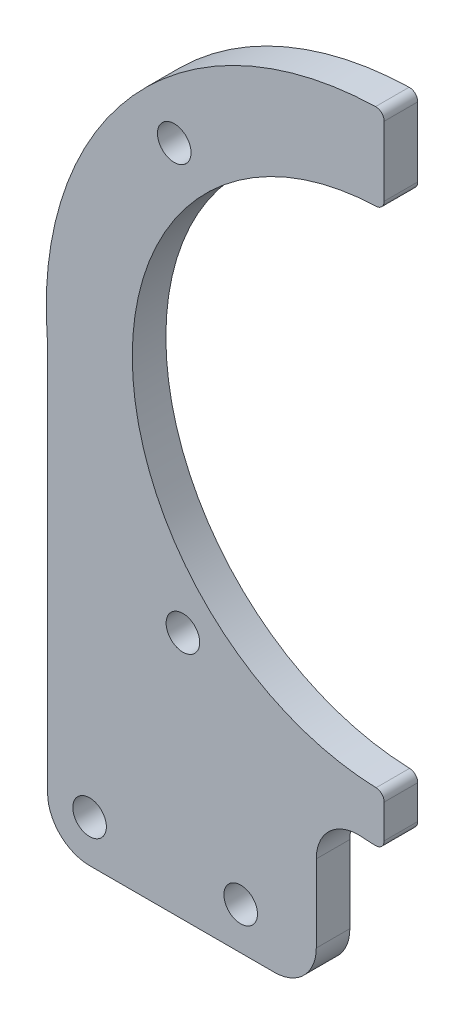
ISO-10303-21;
HEADER;
FILE_DESCRIPTION(('STEP AP214'),'2;1');
FILE_NAME('part.step','',(''),(''),'','','');
FILE_SCHEMA(('AUTOMOTIVE_DESIGN { 1 0 10303 214 1 1 1 1 }'));
ENDSEC;
DATA;
#1=APPLICATION_CONTEXT('core data for automotive mechanical design processes');
#2=APPLICATION_PROTOCOL_DEFINITION('international standard','automotive_design',2000,#1);
#3=PRODUCT_CONTEXT('',#1,'mechanical');
#4=PRODUCT('Part','Part','',(#3));
#5=PRODUCT_RELATED_PRODUCT_CATEGORY('part','',(#4));
#6=PRODUCT_DEFINITION_FORMATION('','',#4);
#7=PRODUCT_DEFINITION_CONTEXT('part definition',#1,'design');
#8=PRODUCT_DEFINITION('design','',#6,#7);
#9=PRODUCT_DEFINITION_SHAPE('','',#8);
#10=(LENGTH_UNIT() NAMED_UNIT(*) SI_UNIT(.MILLI.,.METRE.));
#11=(NAMED_UNIT(*) PLANE_ANGLE_UNIT() SI_UNIT($,.RADIAN.));
#12=(NAMED_UNIT(*) SI_UNIT($,.STERADIAN.) SOLID_ANGLE_UNIT());
#13=UNCERTAINTY_MEASURE_WITH_UNIT(LENGTH_MEASURE(1.E-05),#10,'distance_accuracy_value','');
#14=(GEOMETRIC_REPRESENTATION_CONTEXT(3) GLOBAL_UNCERTAINTY_ASSIGNED_CONTEXT((#13)) GLOBAL_UNIT_ASSIGNED_CONTEXT((#10,
#11,#12)) REPRESENTATION_CONTEXT('',''));
#15=CARTESIAN_POINT('',(0.,0.,0.));
#16=DIRECTION('',(0.,0.,1.));
#17=DIRECTION('',(1.,0.,0.));
#18=AXIS2_PLACEMENT_3D('',#15,#16,#17);
#19=CARTESIAN_POINT('',(35.0862822428805,50.0800803803024,4.));
#20=DIRECTION('',(0.,0.,1.));
#21=DIRECTION('',(1.,0.,0.));
#22=AXIS2_PLACEMENT_3D('',#19,#20,#21);
#23=PLANE('',#22);
#24=CARTESIAN_POINT('',(11.1177665862284,24.5749778081342,4.));
#25=DIRECTION('',(0.,0.,1.));
#26=DIRECTION('',(1.,0.,0.));
#27=AXIS2_PLACEMENT_3D('',#24,#25,#26);
#28=CIRCLE('',#27,2.);
#29=CARTESIAN_POINT('',(13.1177665862284,24.5749778081342,4.));
#30=VERTEX_POINT('',#29);
#31=EDGE_CURVE('E278',#30,#30,#28,.T.);
#32=ORIENTED_EDGE('',*,*,#31,.F.);
#33=EDGE_LOOP('',(#32));
#34=FACE_BOUND('',#33,.T.);
#35=CARTESIAN_POINT('',(10.0862822428805,74.5749778081342,4.));
#36=DIRECTION('',(0.,0.,1.));
#37=DIRECTION('',(1.,0.,0.));
#38=AXIS2_PLACEMENT_3D('',#35,#36,#37);
#39=CIRCLE('',#38,2.);
#40=CARTESIAN_POINT('',(12.0862822428805,74.5749778081342,4.));
#41=VERTEX_POINT('',#40);
#42=EDGE_CURVE('E267',#41,#41,#39,.T.);
#43=ORIENTED_EDGE('',*,*,#42,.F.);
#44=EDGE_LOOP('',(#43));
#45=FACE_BOUND('',#44,.T.);
#46=CARTESIAN_POINT('',(0.,0.,4.));
#47=DIRECTION('',(0.,0.,1.));
#48=DIRECTION('',(1.,0.,0.));
#49=AXIS2_PLACEMENT_3D('',#46,#47,#48);
#50=CIRCLE('',#49,2.);
#51=CARTESIAN_POINT('',(2.,0.,4.));
#52=VERTEX_POINT('',#51);
#53=EDGE_CURVE('E180',#52,#52,#50,.T.);
#54=ORIENTED_EDGE('',*,*,#53,.F.);
#55=EDGE_LOOP('',(#54));
#56=FACE_BOUND('',#55,.T.);
#57=DIRECTION('',(1.,0.,0.));
#58=VECTOR('',#57,1.);
#59=CARTESIAN_POINT('',(-5.,-5.,4.));
#60=LINE('',#59,#58);
#61=CARTESIAN_POINT('',(0.,-5.,4.));
#62=VERTEX_POINT('',#61);
#63=CARTESIAN_POINT('',(22.,-5.,4.));
#64=VERTEX_POINT('',#63);
#65=EDGE_CURVE('E289',#62,#64,#60,.T.);
#66=ORIENTED_EDGE('',*,*,#65,.T.);
#67=CARTESIAN_POINT('',(22.,0.,4.));
#68=DIRECTION('',(0.,0.,1.));
#69=DIRECTION('',(1.,0.,0.));
#70=AXIS2_PLACEMENT_3D('',#67,#68,#69);
#71=CIRCLE('',#70,5.);
#72=CARTESIAN_POINT('',(27.,0.,4.));
#73=VERTEX_POINT('',#72);
#74=EDGE_CURVE('E258',#64,#73,#71,.T.);
#75=ORIENTED_EDGE('',*,*,#74,.T.);
#76=DIRECTION('',(0.,1.,0.));
#77=VECTOR('',#76,1.);
#78=CARTESIAN_POINT('',(27.,-5.,4.));
#79=LINE('',#78,#77);
#80=CARTESIAN_POINT('',(27.,9.19640561986431,4.));
#81=VERTEX_POINT('',#80);
#82=EDGE_CURVE('E292',#73,#81,#79,.T.);
#83=ORIENTED_EDGE('',*,*,#82,.T.);
#84=CARTESIAN_POINT('',(32.,9.19640561986431,4.));
#85=DIRECTION('',(0.,0.,1.));
#86=DIRECTION('',(1.,0.,0.));
#87=AXIS2_PLACEMENT_3D('',#84,#85,#86);
#88=CIRCLE('',#87,5.);
#89=CARTESIAN_POINT('',(32.3763758832781,14.1822196150397,4.));
#90=VERTEX_POINT('',#89);
#91=EDGE_CURVE('E11',#81,#90,#88,.F.);
#92=ORIENTED_EDGE('',*,*,#91,.T.);
#93=CARTESIAN_POINT('',(35.0862822428805,50.0800803803024,4.));
#94=DIRECTION('',(0.,0.,1.));
#95=DIRECTION('',(1.,0.,0.));
#96=AXIS2_PLACEMENT_3D('',#93,#94,#95);
#97=CIRCLE('',#96,36.);
#98=CARTESIAN_POINT('',(34.0577108143091,14.0947772578285,4.));
#99=VERTEX_POINT('',#98);
#100=EDGE_CURVE('E294',#90,#99,#97,.T.);
#101=ORIENTED_EDGE('',*,*,#100,.T.);
#102=CARTESIAN_POINT('',(34.0862822428805,15.0943690112306,4.));
#103=DIRECTION('',(0.,0.,1.));
#104=DIRECTION('',(1.,0.,0.));
#105=AXIS2_PLACEMENT_3D('',#102,#103,#104);
#106=CIRCLE('',#105,1.);
#107=CARTESIAN_POINT('',(35.0862822428805,15.0943690112306,4.));
#108=VERTEX_POINT('',#107);
#109=EDGE_CURVE('E215',#99,#108,#106,.T.);
#110=ORIENTED_EDGE('',*,*,#109,.T.);
#111=DIRECTION('',(0.,1.,0.));
#112=VECTOR('',#111,1.);
#113=CARTESIAN_POINT('',(35.0862822428805,20.0800803803024,4.));
#114=LINE('',#113,#112);
#115=CARTESIAN_POINT('',(35.0862822428805,19.096213610643,4.));
#116=VERTEX_POINT('',#115);
#117=EDGE_CURVE('E296',#108,#116,#114,.T.);
#118=ORIENTED_EDGE('',*,*,#117,.T.);
#119=CARTESIAN_POINT('',(34.0862822428805,19.096213610643,4.));
#120=DIRECTION('',(0.,0.,1.));
#121=DIRECTION('',(1.,0.,0.));
#122=AXIS2_PLACEMENT_3D('',#119,#120,#121);
#123=CIRCLE('',#122,1.);
#124=CARTESIAN_POINT('',(34.1185403073966,20.0956931838579,4.));
#125=VERTEX_POINT('',#124);
#126=EDGE_CURVE('E213',#116,#125,#123,.T.);
#127=ORIENTED_EDGE('',*,*,#126,.T.);
#128=CARTESIAN_POINT('',(35.0862822428805,50.0800803803024,4.));
#129=DIRECTION('',(0.,0.,-1.));
#130=DIRECTION('',(1.,0.,0.));
#131=AXIS2_PLACEMENT_3D('',#128,#129,#130);
#132=CIRCLE('',#131,30.);
#133=CARTESIAN_POINT('',(34.1185403073966,80.0644675767469,4.));
#134=VERTEX_POINT('',#133);
#135=EDGE_CURVE('E298',#125,#134,#132,.T.);
#136=ORIENTED_EDGE('',*,*,#135,.T.);
#137=CARTESIAN_POINT('',(34.0862822428805,81.0639471499617,4.));
#138=DIRECTION('',(0.,0.,1.));
#139=DIRECTION('',(1.,0.,0.));
#140=AXIS2_PLACEMENT_3D('',#137,#138,#139);
#141=CIRCLE('',#140,1.);
#142=CARTESIAN_POINT('',(35.0862822428805,81.0639471499617,4.));
#143=VERTEX_POINT('',#142);
#144=EDGE_CURVE('E217',#134,#143,#141,.T.);
#145=ORIENTED_EDGE('',*,*,#144,.T.);
#146=DIRECTION('',(0.,1.,0.));
#147=VECTOR('',#146,1.);
#148=CARTESIAN_POINT('',(35.0862822428805,90.33232928245,4.));
#149=LINE('',#148,#147);
#150=CARTESIAN_POINT('',(35.0862822428805,89.3195890912451,4.));
#151=VERTEX_POINT('',#150);
#152=EDGE_CURVE('E173',#143,#151,#149,.T.);
#153=ORIENTED_EDGE('',*,*,#152,.T.);
#154=CARTESIAN_POINT('',(34.0862822428805,89.3195890912451,4.));
#155=DIRECTION('',(0.,0.,1.));
#156=DIRECTION('',(1.,0.,0.));
#157=AXIS2_PLACEMENT_3D('',#154,#155,#156);
#158=CIRCLE('',#157,1.);
#159=CARTESIAN_POINT('',(34.0608059955834,90.3192645189834,4.));
#160=VERTEX_POINT('',#159);
#161=EDGE_CURVE('E219',#151,#160,#158,.T.);
#162=ORIENTED_EDGE('',*,*,#161,.T.);
#163=CARTESIAN_POINT('',(35.0862822428805,50.0800803803024,4.));
#164=DIRECTION('',(0.,0.,1.));
#165=DIRECTION('',(1.,0.,0.));
#166=AXIS2_PLACEMENT_3D('',#163,#164,#165);
#167=CIRCLE('',#166,40.2522489021477);
#168=CARTESIAN_POINT('',(-5.03302671281246,46.8113511779821,4.));
#169=VERTEX_POINT('',#168);
#170=EDGE_CURVE('E171',#160,#169,#167,.T.);
#171=ORIENTED_EDGE('',*,*,#170,.T.);
#172=CARTESIAN_POINT('',(-15.,45.9992899164445,4.));
#173=DIRECTION('',(0.,0.,1.));
#174=DIRECTION('',(1.,0.,0.));
#175=AXIS2_PLACEMENT_3D('',#172,#173,#174);
#176=CIRCLE('',#175,10.);
#177=CARTESIAN_POINT('',(-5.,45.9992899164445,4.));
#178=VERTEX_POINT('',#177);
#179=EDGE_CURVE('E240',#169,#178,#176,.F.);
#180=ORIENTED_EDGE('',*,*,#179,.T.);
#181=DIRECTION('',(0.,-1.,0.));
#182=VECTOR('',#181,1.);
#183=CARTESIAN_POINT('',(-5.,-5.,4.));
#184=LINE('',#183,#182);
#185=CARTESIAN_POINT('',(-5.,0.,4.));
#186=VERTEX_POINT('',#185);
#187=EDGE_CURVE('E286',#178,#186,#184,.T.);
#188=ORIENTED_EDGE('',*,*,#187,.T.);
#189=CARTESIAN_POINT('',(0.,0.,4.));
#190=DIRECTION('',(0.,0.,1.));
#191=DIRECTION('',(1.,0.,0.));
#192=AXIS2_PLACEMENT_3D('',#189,#190,#191);
#193=CIRCLE('',#192,5.);
#194=EDGE_CURVE('E249',#186,#62,#193,.T.);
#195=ORIENTED_EDGE('',*,*,#194,.T.);
#196=EDGE_LOOP('',(#66,#75,#83,#92,#101,#110,#118,#127,#136,#145,#153,#162,#171,#180,#188,#195));
#197=FACE_BOUND('',#196,.T.);
#198=CARTESIAN_POINT('',(18.,0.,4.));
#199=DIRECTION('',(0.,0.,1.));
#200=DIRECTION('',(1.,0.,0.));
#201=AXIS2_PLACEMENT_3D('',#198,#199,#200);
#202=CIRCLE('',#201,2.);
#203=CARTESIAN_POINT('',(20.,0.,4.));
#204=VERTEX_POINT('',#203);
#205=EDGE_CURVE('E271',#204,#204,#202,.T.);
#206=ORIENTED_EDGE('',*,*,#205,.F.);
#207=EDGE_LOOP('',(#206));
#208=FACE_BOUND('',#207,.T.);
#209=ADVANCED_FACE('F37',(#34,#45,#56,#197,#208),#23,.T.);
#210=CARTESIAN_POINT('',(35.0862822428805,50.0800803803024,0.));
#211=DIRECTION('',(0.,0.,1.));
#212=DIRECTION('',(1.,0.,0.));
#213=AXIS2_PLACEMENT_3D('',#210,#211,#212);
#214=PLANE('',#213);
#215=CARTESIAN_POINT('',(11.1177665862284,24.5749778081342,0.));
#216=DIRECTION('',(0.,0.,1.));
#217=DIRECTION('',(1.,0.,0.));
#218=AXIS2_PLACEMENT_3D('',#215,#216,#217);
#219=CIRCLE('',#218,2.);
#220=CARTESIAN_POINT('',(13.1177665862284,24.5749778081342,0.));
#221=VERTEX_POINT('',#220);
#222=EDGE_CURVE('E41',#221,#221,#219,.T.);
#223=ORIENTED_EDGE('',*,*,#222,.T.);
#224=EDGE_LOOP('',(#223));
#225=FACE_BOUND('',#224,.T.);
#226=CARTESIAN_POINT('',(10.0862822428805,74.5749778081342,0.));
#227=DIRECTION('',(0.,0.,1.));
#228=DIRECTION('',(1.,0.,0.));
#229=AXIS2_PLACEMENT_3D('',#226,#227,#228);
#230=CIRCLE('',#229,2.);
#231=CARTESIAN_POINT('',(12.0862822428805,74.5749778081342,0.));
#232=VERTEX_POINT('',#231);
#233=EDGE_CURVE('E264',#232,#232,#230,.T.);
#234=ORIENTED_EDGE('',*,*,#233,.T.);
#235=EDGE_LOOP('',(#234));
#236=FACE_BOUND('',#235,.T.);
#237=DIRECTION('',(0.,1.,0.));
#238=VECTOR('',#237,1.);
#239=CARTESIAN_POINT('',(27.,-5.,0.));
#240=LINE('',#239,#238);
#241=CARTESIAN_POINT('',(27.,0.,0.));
#242=VERTEX_POINT('',#241);
#243=CARTESIAN_POINT('',(27.,9.19640561986431,0.));
#244=VERTEX_POINT('',#243);
#245=EDGE_CURVE('E193',#242,#244,#240,.T.);
#246=ORIENTED_EDGE('',*,*,#245,.F.);
#247=CARTESIAN_POINT('',(22.,0.,0.));
#248=DIRECTION('',(0.,0.,1.));
#249=DIRECTION('',(1.,0.,0.));
#250=AXIS2_PLACEMENT_3D('',#247,#248,#249);
#251=CIRCLE('',#250,5.);
#252=CARTESIAN_POINT('',(22.,-5.,0.));
#253=VERTEX_POINT('',#252);
#254=EDGE_CURVE('E254',#242,#253,#251,.F.);
#255=ORIENTED_EDGE('',*,*,#254,.T.);
#256=DIRECTION('',(1.,0.,0.));
#257=VECTOR('',#256,1.);
#258=CARTESIAN_POINT('',(-5.,-5.,0.));
#259=LINE('',#258,#257);
#260=CARTESIAN_POINT('',(0.,-5.,0.));
#261=VERTEX_POINT('',#260);
#262=EDGE_CURVE('E183',#261,#253,#259,.T.);
#263=ORIENTED_EDGE('',*,*,#262,.F.);
#264=CARTESIAN_POINT('',(0.,0.,0.));
#265=DIRECTION('',(0.,0.,1.));
#266=DIRECTION('',(1.,0.,0.));
#267=AXIS2_PLACEMENT_3D('',#264,#265,#266);
#268=CIRCLE('',#267,5.);
#269=CARTESIAN_POINT('',(-5.,0.,0.));
#270=VERTEX_POINT('',#269);
#271=EDGE_CURVE('E245',#261,#270,#268,.F.);
#272=ORIENTED_EDGE('',*,*,#271,.T.);
#273=DIRECTION('',(0.,-1.,0.));
#274=VECTOR('',#273,1.);
#275=CARTESIAN_POINT('',(-5.,-5.,0.));
#276=LINE('',#275,#274);
#277=CARTESIAN_POINT('',(-5.,45.9992899164445,0.));
#278=VERTEX_POINT('',#277);
#279=EDGE_CURVE('E179',#278,#270,#276,.T.);
#280=ORIENTED_EDGE('',*,*,#279,.F.);
#281=CARTESIAN_POINT('',(-15.,45.9992899164445,0.));
#282=DIRECTION('',(0.,0.,1.));
#283=DIRECTION('',(1.,0.,0.));
#284=AXIS2_PLACEMENT_3D('',#281,#282,#283);
#285=CIRCLE('',#284,10.);
#286=CARTESIAN_POINT('',(-5.03302671281246,46.8113511779821,0.));
#287=VERTEX_POINT('',#286);
#288=EDGE_CURVE('E178',#278,#287,#285,.T.);
#289=ORIENTED_EDGE('',*,*,#288,.T.);
#290=CARTESIAN_POINT('',(35.0862822428805,50.0800803803024,0.));
#291=DIRECTION('',(0.,0.,1.));
#292=DIRECTION('',(1.,0.,0.));
#293=AXIS2_PLACEMENT_3D('',#290,#291,#292);
#294=CIRCLE('',#293,40.2522489021477);
#295=CARTESIAN_POINT('',(34.0608059955834,90.3192645189834,0.));
#296=VERTEX_POINT('',#295);
#297=EDGE_CURVE('E168',#296,#287,#294,.T.);
#298=ORIENTED_EDGE('',*,*,#297,.F.);
#299=CARTESIAN_POINT('',(34.0862822428805,89.3195890912451,0.));
#300=DIRECTION('',(0.,0.,1.));
#301=DIRECTION('',(1.,0.,0.));
#302=AXIS2_PLACEMENT_3D('',#299,#300,#301);
#303=CIRCLE('',#302,1.);
#304=CARTESIAN_POINT('',(35.0862822428805,89.3195890912451,0.));
#305=VERTEX_POINT('',#304);
#306=EDGE_CURVE('E152',#296,#305,#303,.F.);
#307=ORIENTED_EDGE('',*,*,#306,.T.);
#308=DIRECTION('',(0.,1.,0.));
#309=VECTOR('',#308,1.);
#310=CARTESIAN_POINT('',(35.0862822428805,90.33232928245,0.));
#311=LINE('',#310,#309);
#312=CARTESIAN_POINT('',(35.0862822428805,81.0639471499617,0.));
#313=VERTEX_POINT('',#312);
#314=EDGE_CURVE('E203',#313,#305,#311,.T.);
#315=ORIENTED_EDGE('',*,*,#314,.F.);
#316=CARTESIAN_POINT('',(34.0862822428805,81.0639471499617,0.));
#317=DIRECTION('',(0.,0.,1.));
#318=DIRECTION('',(1.,0.,0.));
#319=AXIS2_PLACEMENT_3D('',#316,#317,#318);
#320=CIRCLE('',#319,1.);
#321=CARTESIAN_POINT('',(34.1185403073966,80.0644675767469,0.));
#322=VERTEX_POINT('',#321);
#323=EDGE_CURVE('E162',#313,#322,#320,.F.);
#324=ORIENTED_EDGE('',*,*,#323,.T.);
#325=CARTESIAN_POINT('',(35.0862822428805,50.0800803803024,0.));
#326=DIRECTION('',(0.,0.,-1.));
#327=DIRECTION('',(1.,0.,0.));
#328=AXIS2_PLACEMENT_3D('',#325,#326,#327);
#329=CIRCLE('',#328,30.);
#330=CARTESIAN_POINT('',(34.1185403073966,20.0956931838579,0.));
#331=VERTEX_POINT('',#330);
#332=EDGE_CURVE('E200',#331,#322,#329,.T.);
#333=ORIENTED_EDGE('',*,*,#332,.F.);
#334=CARTESIAN_POINT('',(34.0862822428805,19.096213610643,0.));
#335=DIRECTION('',(0.,0.,1.));
#336=DIRECTION('',(1.,0.,0.));
#337=AXIS2_PLACEMENT_3D('',#334,#335,#336);
#338=CIRCLE('',#337,1.);
#339=CARTESIAN_POINT('',(35.0862822428805,19.096213610643,0.));
#340=VERTEX_POINT('',#339);
#341=EDGE_CURVE('E172',#331,#340,#338,.F.);
#342=ORIENTED_EDGE('',*,*,#341,.T.);
#343=DIRECTION('',(0.,1.,0.));
#344=VECTOR('',#343,1.);
#345=CARTESIAN_POINT('',(35.0862822428805,20.0800803803024,0.));
#346=LINE('',#345,#344);
#347=CARTESIAN_POINT('',(35.0862822428805,15.0943690112306,0.));
#348=VERTEX_POINT('',#347);
#349=EDGE_CURVE('E197',#348,#340,#346,.T.);
#350=ORIENTED_EDGE('',*,*,#349,.F.);
#351=CARTESIAN_POINT('',(34.0862822428805,15.0943690112306,0.));
#352=DIRECTION('',(0.,0.,1.));
#353=DIRECTION('',(1.,0.,0.));
#354=AXIS2_PLACEMENT_3D('',#351,#352,#353);
#355=CIRCLE('',#354,1.);
#356=CARTESIAN_POINT('',(34.0577108143091,14.0947772578285,0.));
#357=VERTEX_POINT('',#356);
#358=EDGE_CURVE('E206',#348,#357,#355,.F.);
#359=ORIENTED_EDGE('',*,*,#358,.T.);
#360=CARTESIAN_POINT('',(35.0862822428805,50.0800803803024,0.));
#361=DIRECTION('',(0.,0.,1.));
#362=DIRECTION('',(1.,0.,0.));
#363=AXIS2_PLACEMENT_3D('',#360,#361,#362);
#364=CIRCLE('',#363,36.);
#365=CARTESIAN_POINT('',(32.3763758832781,14.1822196150397,0.));
#366=VERTEX_POINT('',#365);
#367=EDGE_CURVE('E195',#366,#357,#364,.T.);
#368=ORIENTED_EDGE('',*,*,#367,.F.);
#369=CARTESIAN_POINT('',(32.,9.19640561986431,0.));
#370=DIRECTION('',(0.,0.,1.));
#371=DIRECTION('',(1.,0.,0.));
#372=AXIS2_PLACEMENT_3D('',#369,#370,#371);
#373=CIRCLE('',#372,5.);
#374=EDGE_CURVE('E46',#366,#244,#373,.T.);
#375=ORIENTED_EDGE('',*,*,#374,.T.);
#376=EDGE_LOOP('',(#246,#255,#263,#272,#280,#289,#298,#307,#315,#324,#333,#342,#350,#359,#368,#375));
#377=FACE_BOUND('',#376,.T.);
#378=CARTESIAN_POINT('',(0.,0.,0.));
#379=DIRECTION('',(0.,0.,1.));
#380=DIRECTION('',(1.,0.,0.));
#381=AXIS2_PLACEMENT_3D('',#378,#379,#380);
#382=CIRCLE('',#381,2.);
#383=CARTESIAN_POINT('',(2.,0.,0.));
#384=VERTEX_POINT('',#383);
#385=EDGE_CURVE('E186',#384,#384,#382,.T.);
#386=ORIENTED_EDGE('',*,*,#385,.T.);
#387=EDGE_LOOP('',(#386));
#388=FACE_BOUND('',#387,.T.);
#389=CARTESIAN_POINT('',(18.,0.,0.));
#390=DIRECTION('',(0.,0.,1.));
#391=DIRECTION('',(1.,0.,0.));
#392=AXIS2_PLACEMENT_3D('',#389,#390,#391);
#393=CIRCLE('',#392,2.);
#394=CARTESIAN_POINT('',(20.,0.,0.));
#395=VERTEX_POINT('',#394);
#396=EDGE_CURVE('E266',#395,#395,#393,.T.);
#397=ORIENTED_EDGE('',*,*,#396,.T.);
#398=EDGE_LOOP('',(#397));
#399=FACE_BOUND('',#398,.T.);
#400=ADVANCED_FACE('F175',(#225,#236,#377,#388,#399),#214,.F.);
#401=CARTESIAN_POINT('',(35.0862822428805,50.0800803803024,4.));
#402=DIRECTION('',(0.,0.,-1.));
#403=DIRECTION('',(-1.,0.,0.));
#404=AXIS2_PLACEMENT_3D('',#401,#402,#403);
#405=CYLINDRICAL_SURFACE('',#404,40.2522489021477);
#406=ORIENTED_EDGE('',*,*,#297,.T.);
#407=DIRECTION('',(0.,0.,-1.));
#408=VECTOR('',#407,1.);
#409=CARTESIAN_POINT('',(-5.03302671281247,46.8113511779821,4.));
#410=LINE('',#409,#408);
#411=EDGE_CURVE('E237',#287,#169,#410,.F.);
#412=ORIENTED_EDGE('',*,*,#411,.T.);
#413=ORIENTED_EDGE('',*,*,#170,.F.);
#414=DIRECTION('',(0.,0.,-1.));
#415=VECTOR('',#414,1.);
#416=CARTESIAN_POINT('',(34.0608059955834,90.3192645189834,4.));
#417=LINE('',#416,#415);
#418=EDGE_CURVE('E156',#160,#296,#417,.T.);
#419=ORIENTED_EDGE('',*,*,#418,.T.);
#420=EDGE_LOOP('',(#406,#412,#413,#419));
#421=FACE_BOUND('',#420,.T.);
#422=ADVANCED_FACE('F167',(#421),#405,.T.);
#423=CARTESIAN_POINT('',(-5.,-5.,4.));
#424=DIRECTION('',(1.,0.,0.));
#425=DIRECTION('',(0.,1.,0.));
#426=AXIS2_PLACEMENT_3D('',#423,#424,#425);
#427=PLANE('',#426);
#428=ORIENTED_EDGE('',*,*,#279,.T.);
#429=DIRECTION('',(0.,0.,-1.));
#430=VECTOR('',#429,1.);
#431=CARTESIAN_POINT('',(-5.,0.,4.));
#432=LINE('',#431,#430);
#433=EDGE_CURVE('E247',#270,#186,#432,.F.);
#434=ORIENTED_EDGE('',*,*,#433,.T.);
#435=ORIENTED_EDGE('',*,*,#187,.F.);
#436=DIRECTION('',(0.,0.,1.));
#437=VECTOR('',#436,1.);
#438=CARTESIAN_POINT('',(-5.,45.9992899164445,0.));
#439=LINE('',#438,#437);
#440=EDGE_CURVE('E234',#178,#278,#439,.F.);
#441=ORIENTED_EDGE('',*,*,#440,.T.);
#442=EDGE_LOOP('',(#428,#434,#435,#441));
#443=FACE_BOUND('',#442,.T.);
#444=ADVANCED_FACE('F351',(#443),#427,.F.);
#445=CARTESIAN_POINT('',(-5.,-5.,4.));
#446=DIRECTION('',(0.,1.,0.));
#447=DIRECTION('',(0.,0.,1.));
#448=AXIS2_PLACEMENT_3D('',#445,#446,#447);
#449=PLANE('',#448);
#450=ORIENTED_EDGE('',*,*,#262,.T.);
#451=DIRECTION('',(0.,0.,-1.));
#452=VECTOR('',#451,1.);
#453=CARTESIAN_POINT('',(22.,-5.,4.));
#454=LINE('',#453,#452);
#455=EDGE_CURVE('E256',#253,#64,#454,.F.);
#456=ORIENTED_EDGE('',*,*,#455,.T.);
#457=ORIENTED_EDGE('',*,*,#65,.F.);
#458=DIRECTION('',(0.,0.,-1.));
#459=VECTOR('',#458,1.);
#460=CARTESIAN_POINT('',(0.,-5.,4.));
#461=LINE('',#460,#459);
#462=EDGE_CURVE('E242',#62,#261,#461,.T.);
#463=ORIENTED_EDGE('',*,*,#462,.T.);
#464=EDGE_LOOP('',(#450,#456,#457,#463));
#465=FACE_BOUND('',#464,.T.);
#466=ADVANCED_FACE('F343',(#465),#449,.F.);
#467=CARTESIAN_POINT('',(27.,-5.,4.));
#468=DIRECTION('',(-1.,0.,0.));
#469=DIRECTION('',(0.,-1.,0.));
#470=AXIS2_PLACEMENT_3D('',#467,#468,#469);
#471=PLANE('',#470);
#472=ORIENTED_EDGE('',*,*,#245,.T.);
#473=DIRECTION('',(0.,0.,1.));
#474=VECTOR('',#473,1.);
#475=CARTESIAN_POINT('',(27.,9.19640561986431,4.));
#476=LINE('',#475,#474);
#477=EDGE_CURVE('E60',#244,#81,#476,.T.);
#478=ORIENTED_EDGE('',*,*,#477,.T.);
#479=ORIENTED_EDGE('',*,*,#82,.F.);
#480=DIRECTION('',(0.,0.,-1.));
#481=VECTOR('',#480,1.);
#482=CARTESIAN_POINT('',(27.,0.,4.));
#483=LINE('',#482,#481);
#484=EDGE_CURVE('E251',#73,#242,#483,.T.);
#485=ORIENTED_EDGE('',*,*,#484,.T.);
#486=EDGE_LOOP('',(#472,#478,#479,#485));
#487=FACE_BOUND('',#486,.T.);
#488=ADVANCED_FACE('F337',(#487),#471,.F.);
#489=CARTESIAN_POINT('',(35.0862822428805,50.0800803803024,4.));
#490=DIRECTION('',(0.,0.,-1.));
#491=DIRECTION('',(-1.,0.,0.));
#492=AXIS2_PLACEMENT_3D('',#489,#490,#491);
#493=CYLINDRICAL_SURFACE('',#492,36.);
#494=ORIENTED_EDGE('',*,*,#100,.F.);
#495=DIRECTION('',(0.,0.,-1.));
#496=VECTOR('',#495,1.);
#497=CARTESIAN_POINT('',(32.3763758832781,14.1822196150397,4.));
#498=LINE('',#497,#496);
#499=EDGE_CURVE('E260',#90,#366,#498,.T.);
#500=ORIENTED_EDGE('',*,*,#499,.T.);
#501=ORIENTED_EDGE('',*,*,#367,.T.);
#502=DIRECTION('',(0.,0.,-1.));
#503=VECTOR('',#502,1.);
#504=CARTESIAN_POINT('',(34.0577108143091,14.0947772578285,4.));
#505=LINE('',#504,#503);
#506=EDGE_CURVE('E231',#357,#99,#505,.F.);
#507=ORIENTED_EDGE('',*,*,#506,.T.);
#508=EDGE_LOOP('',(#494,#500,#501,#507));
#509=FACE_BOUND('',#508,.T.);
#510=ADVANCED_FACE('F331',(#509),#493,.T.);
#511=CARTESIAN_POINT('',(35.0862822428805,20.0800803803024,4.));
#512=DIRECTION('',(-1.,0.,0.));
#513=DIRECTION('',(0.,0.,1.));
#514=AXIS2_PLACEMENT_3D('',#511,#512,#513);
#515=PLANE('',#514);
#516=ORIENTED_EDGE('',*,*,#117,.F.);
#517=DIRECTION('',(0.,0.,-1.));
#518=VECTOR('',#517,1.);
#519=CARTESIAN_POINT('',(35.0862822428805,15.0943690112306,4.));
#520=LINE('',#519,#518);
#521=EDGE_CURVE('E228',#108,#348,#520,.T.);
#522=ORIENTED_EDGE('',*,*,#521,.T.);
#523=ORIENTED_EDGE('',*,*,#349,.T.);
#524=DIRECTION('',(0.,0.,-1.));
#525=VECTOR('',#524,1.);
#526=CARTESIAN_POINT('',(35.0862822428805,19.096213610643,4.));
#527=LINE('',#526,#525);
#528=EDGE_CURVE('E226',#340,#116,#527,.F.);
#529=ORIENTED_EDGE('',*,*,#528,.T.);
#530=EDGE_LOOP('',(#516,#522,#523,#529));
#531=FACE_BOUND('',#530,.T.);
#532=ADVANCED_FACE('F323',(#531),#515,.F.);
#533=CARTESIAN_POINT('',(35.0862822428805,50.0800803803024,4.));
#534=DIRECTION('',(0.,0.,-1.));
#535=DIRECTION('',(-1.,0.,0.));
#536=AXIS2_PLACEMENT_3D('',#533,#534,#535);
#537=CYLINDRICAL_SURFACE('',#536,30.);
#538=ORIENTED_EDGE('',*,*,#332,.T.);
#539=DIRECTION('',(0.,0.,-1.));
#540=VECTOR('',#539,1.);
#541=CARTESIAN_POINT('',(34.1185403073966,80.0644675767469,4.));
#542=LINE('',#541,#540);
#543=EDGE_CURVE('E224',#322,#134,#542,.F.);
#544=ORIENTED_EDGE('',*,*,#543,.T.);
#545=ORIENTED_EDGE('',*,*,#135,.F.);
#546=DIRECTION('',(0.,0.,-1.));
#547=VECTOR('',#546,1.);
#548=CARTESIAN_POINT('',(34.1185403073966,20.0956931838579,4.));
#549=LINE('',#548,#547);
#550=EDGE_CURVE('E221',#125,#331,#549,.T.);
#551=ORIENTED_EDGE('',*,*,#550,.T.);
#552=EDGE_LOOP('',(#538,#544,#545,#551));
#553=FACE_BOUND('',#552,.T.);
#554=ADVANCED_FACE('F314',(#553),#537,.F.);
#555=CARTESIAN_POINT('',(35.0862822428805,90.33232928245,4.));
#556=DIRECTION('',(-1.,0.,0.));
#557=DIRECTION('',(0.,0.,1.));
#558=AXIS2_PLACEMENT_3D('',#555,#556,#557);
#559=PLANE('',#558);
#560=ORIENTED_EDGE('',*,*,#314,.T.);
#561=DIRECTION('',(0.,0.,-1.));
#562=VECTOR('',#561,1.);
#563=CARTESIAN_POINT('',(35.0862822428805,89.3195890912451,4.));
#564=LINE('',#563,#562);
#565=EDGE_CURVE('E157',#305,#151,#564,.F.);
#566=ORIENTED_EDGE('',*,*,#565,.T.);
#567=ORIENTED_EDGE('',*,*,#152,.F.);
#568=DIRECTION('',(0.,0.,-1.));
#569=VECTOR('',#568,1.);
#570=CARTESIAN_POINT('',(35.0862822428805,81.0639471499617,4.));
#571=LINE('',#570,#569);
#572=EDGE_CURVE('E161',#143,#313,#571,.T.);
#573=ORIENTED_EDGE('',*,*,#572,.T.);
#574=EDGE_LOOP('',(#560,#566,#567,#573));
#575=FACE_BOUND('',#574,.T.);
#576=ADVANCED_FACE('F308',(#575),#559,.F.);
#577=CARTESIAN_POINT('',(0.,0.,4.));
#578=DIRECTION('',(0.,0.,-1.));
#579=DIRECTION('',(-1.,0.,0.));
#580=AXIS2_PLACEMENT_3D('',#577,#578,#579);
#581=CYLINDRICAL_SURFACE('',#580,2.);
#582=ORIENTED_EDGE('',*,*,#53,.T.);
#583=EDGE_LOOP('',(#582));
#584=FACE_BOUND('',#583,.T.);
#585=ORIENTED_EDGE('',*,*,#385,.F.);
#586=EDGE_LOOP('',(#585));
#587=FACE_BOUND('',#586,.T.);
#588=ADVANCED_FACE('F376',(#584,#587),#581,.F.);
#589=CARTESIAN_POINT('',(18.,0.,4.));
#590=DIRECTION('',(0.,0.,-1.));
#591=DIRECTION('',(-1.,0.,0.));
#592=AXIS2_PLACEMENT_3D('',#589,#590,#591);
#593=CYLINDRICAL_SURFACE('',#592,2.);
#594=ORIENTED_EDGE('',*,*,#205,.T.);
#595=EDGE_LOOP('',(#594));
#596=FACE_BOUND('',#595,.T.);
#597=ORIENTED_EDGE('',*,*,#396,.F.);
#598=EDGE_LOOP('',(#597));
#599=FACE_BOUND('',#598,.T.);
#600=ADVANCED_FACE('F397',(#596,#599),#593,.F.);
#601=CARTESIAN_POINT('',(34.0862822428805,89.3195890912451,4.));
#602=DIRECTION('',(0.,0.,-1.));
#603=DIRECTION('',(-1.,0.,0.));
#604=AXIS2_PLACEMENT_3D('',#601,#602,#603);
#605=CYLINDRICAL_SURFACE('',#604,1.);
#606=ORIENTED_EDGE('',*,*,#161,.F.);
#607=ORIENTED_EDGE('',*,*,#565,.F.);
#608=ORIENTED_EDGE('',*,*,#306,.F.);
#609=ORIENTED_EDGE('',*,*,#418,.F.);
#610=EDGE_LOOP('',(#606,#607,#608,#609));
#611=FACE_BOUND('',#610,.T.);
#612=ADVANCED_FACE('F155',(#611),#605,.T.);
#613=CARTESIAN_POINT('',(34.0862822428805,81.0639471499617,4.));
#614=DIRECTION('',(0.,0.,-1.));
#615=DIRECTION('',(-1.,0.,0.));
#616=AXIS2_PLACEMENT_3D('',#613,#614,#615);
#617=CYLINDRICAL_SURFACE('',#616,1.);
#618=ORIENTED_EDGE('',*,*,#144,.F.);
#619=ORIENTED_EDGE('',*,*,#543,.F.);
#620=ORIENTED_EDGE('',*,*,#323,.F.);
#621=ORIENTED_EDGE('',*,*,#572,.F.);
#622=EDGE_LOOP('',(#618,#619,#620,#621));
#623=FACE_BOUND('',#622,.T.);
#624=ADVANCED_FACE('F310',(#623),#617,.T.);
#625=CARTESIAN_POINT('',(34.0862822428805,15.0943690112306,4.));
#626=DIRECTION('',(0.,0.,-1.));
#627=DIRECTION('',(-1.,0.,0.));
#628=AXIS2_PLACEMENT_3D('',#625,#626,#627);
#629=CYLINDRICAL_SURFACE('',#628,1.);
#630=ORIENTED_EDGE('',*,*,#109,.F.);
#631=ORIENTED_EDGE('',*,*,#506,.F.);
#632=ORIENTED_EDGE('',*,*,#358,.F.);
#633=ORIENTED_EDGE('',*,*,#521,.F.);
#634=EDGE_LOOP('',(#630,#631,#632,#633));
#635=FACE_BOUND('',#634,.T.);
#636=ADVANCED_FACE('F327',(#635),#629,.T.);
#637=CARTESIAN_POINT('',(34.0862822428805,19.096213610643,4.));
#638=DIRECTION('',(0.,0.,-1.));
#639=DIRECTION('',(-1.,0.,0.));
#640=AXIS2_PLACEMENT_3D('',#637,#638,#639);
#641=CYLINDRICAL_SURFACE('',#640,1.);
#642=ORIENTED_EDGE('',*,*,#126,.F.);
#643=ORIENTED_EDGE('',*,*,#528,.F.);
#644=ORIENTED_EDGE('',*,*,#341,.F.);
#645=ORIENTED_EDGE('',*,*,#550,.F.);
#646=EDGE_LOOP('',(#642,#643,#644,#645));
#647=FACE_BOUND('',#646,.T.);
#648=ADVANCED_FACE('F318',(#647),#641,.T.);
#649=CARTESIAN_POINT('',(-15.,45.9992899164445,4.));
#650=DIRECTION('',(0.,0.,-1.));
#651=DIRECTION('',(-1.,0.,0.));
#652=AXIS2_PLACEMENT_3D('',#649,#650,#651);
#653=CYLINDRICAL_SURFACE('',#652,10.);
#654=ORIENTED_EDGE('',*,*,#179,.F.);
#655=ORIENTED_EDGE('',*,*,#411,.F.);
#656=ORIENTED_EDGE('',*,*,#288,.F.);
#657=ORIENTED_EDGE('',*,*,#440,.F.);
#658=EDGE_LOOP('',(#654,#655,#656,#657));
#659=FACE_BOUND('',#658,.T.);
#660=ADVANCED_FACE('F356',(#659),#653,.F.);
#661=CARTESIAN_POINT('',(0.,0.,4.));
#662=DIRECTION('',(0.,0.,-1.));
#663=DIRECTION('',(-1.,0.,0.));
#664=AXIS2_PLACEMENT_3D('',#661,#662,#663);
#665=CYLINDRICAL_SURFACE('',#664,5.);
#666=ORIENTED_EDGE('',*,*,#194,.F.);
#667=ORIENTED_EDGE('',*,*,#433,.F.);
#668=ORIENTED_EDGE('',*,*,#271,.F.);
#669=ORIENTED_EDGE('',*,*,#462,.F.);
#670=EDGE_LOOP('',(#666,#667,#668,#669));
#671=FACE_BOUND('',#670,.T.);
#672=ADVANCED_FACE('F348',(#671),#665,.T.);
#673=CARTESIAN_POINT('',(22.,0.,4.));
#674=DIRECTION('',(0.,0.,-1.));
#675=DIRECTION('',(-1.,0.,0.));
#676=AXIS2_PLACEMENT_3D('',#673,#674,#675);
#677=CYLINDRICAL_SURFACE('',#676,5.);
#678=ORIENTED_EDGE('',*,*,#74,.F.);
#679=ORIENTED_EDGE('',*,*,#455,.F.);
#680=ORIENTED_EDGE('',*,*,#254,.F.);
#681=ORIENTED_EDGE('',*,*,#484,.F.);
#682=EDGE_LOOP('',(#678,#679,#680,#681));
#683=FACE_BOUND('',#682,.T.);
#684=ADVANCED_FACE('F339',(#683),#677,.T.);
#685=CARTESIAN_POINT('',(32.,9.19640561986431,4.));
#686=DIRECTION('',(0.,0.,-1.));
#687=DIRECTION('',(-1.,0.,0.));
#688=AXIS2_PLACEMENT_3D('',#685,#686,#687);
#689=CYLINDRICAL_SURFACE('',#688,5.);
#690=ORIENTED_EDGE('',*,*,#91,.F.);
#691=ORIENTED_EDGE('',*,*,#477,.F.);
#692=ORIENTED_EDGE('',*,*,#374,.F.);
#693=ORIENTED_EDGE('',*,*,#499,.F.);
#694=EDGE_LOOP('',(#690,#691,#692,#693));
#695=FACE_BOUND('',#694,.T.);
#696=ADVANCED_FACE('F39',(#695),#689,.F.);
#697=CARTESIAN_POINT('',(10.0862822428805,74.5749778081342,-16.));
#698=DIRECTION('',(0.,0.,1.));
#699=DIRECTION('',(1.,0.,0.));
#700=AXIS2_PLACEMENT_3D('',#697,#698,#699);
#701=CYLINDRICAL_SURFACE('',#700,2.);
#702=ORIENTED_EDGE('',*,*,#42,.T.);
#703=EDGE_LOOP('',(#702));
#704=FACE_BOUND('',#703,.T.);
#705=ORIENTED_EDGE('',*,*,#233,.F.);
#706=EDGE_LOOP('',(#705));
#707=FACE_BOUND('',#706,.T.);
#708=ADVANCED_FACE('F466',(#704,#707),#701,.F.);
#709=CARTESIAN_POINT('',(11.1177665862284,24.5749778081342,-16.));
#710=DIRECTION('',(0.,0.,1.));
#711=DIRECTION('',(1.,0.,0.));
#712=AXIS2_PLACEMENT_3D('',#709,#710,#711);
#713=CYLINDRICAL_SURFACE('',#712,2.);
#714=ORIENTED_EDGE('',*,*,#31,.T.);
#715=EDGE_LOOP('',(#714));
#716=FACE_BOUND('',#715,.T.);
#717=ORIENTED_EDGE('',*,*,#222,.F.);
#718=EDGE_LOOP('',(#717));
#719=FACE_BOUND('',#718,.T.);
#720=ADVANCED_FACE('F484',(#716,#719),#713,.F.);
#721=CLOSED_SHELL('',(#209,#400,#422,#444,#466,#488,#510,#532,#554,#576,#588,#600,#612,#624,
#636,#648,#660,#672,#684,#696,#708,#720));
#722=MANIFOLD_SOLID_BREP('B2',#721);
#723=ADVANCED_BREP_SHAPE_REPRESENTATION('',(#18,#722),#14);
#724=SHAPE_DEFINITION_REPRESENTATION(#9,#723);
ENDSEC;
END-ISO-10303-21;
